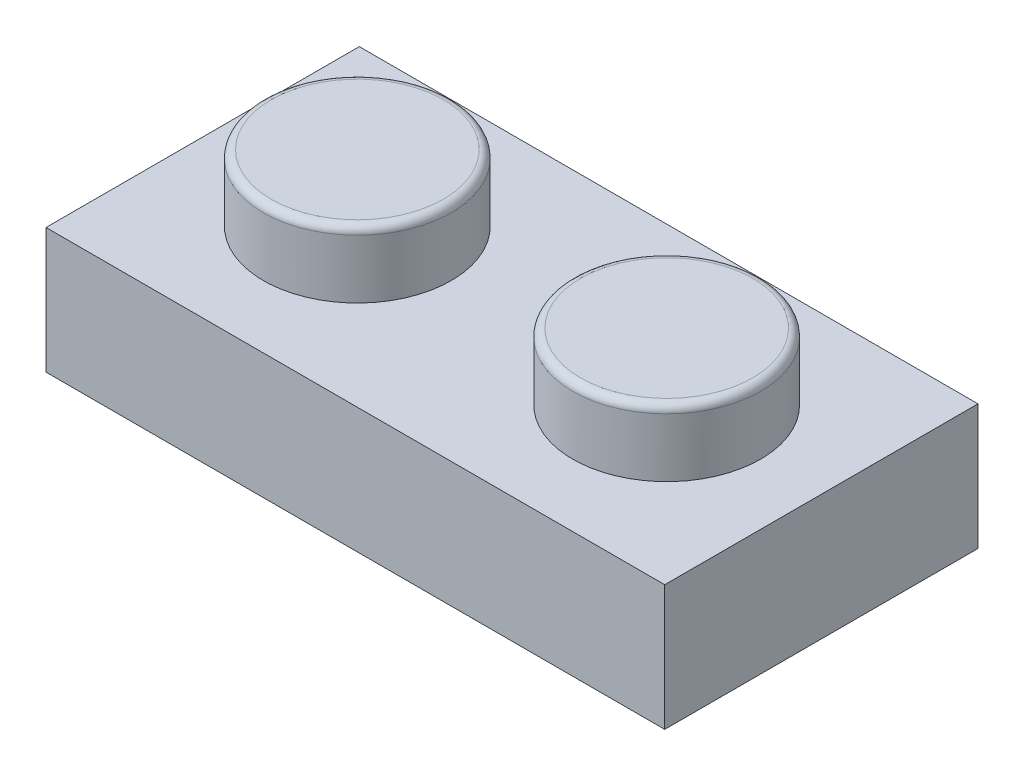
ISO-10303-21;
HEADER;
FILE_DESCRIPTION(('STEP AP214'),'2;1');
FILE_NAME('part.step','',(''),(''),'','','');
FILE_SCHEMA(('AUTOMOTIVE_DESIGN { 1 0 10303 214 1 1 1 1 }'));
ENDSEC;
DATA;
#1=APPLICATION_CONTEXT('core data for automotive mechanical design processes');
#2=APPLICATION_PROTOCOL_DEFINITION('international standard','automotive_design',2000,#1);
#3=PRODUCT_CONTEXT('',#1,'mechanical');
#4=PRODUCT('Part','Part','',(#3));
#5=PRODUCT_RELATED_PRODUCT_CATEGORY('part','',(#4));
#6=PRODUCT_DEFINITION_FORMATION('','',#4);
#7=PRODUCT_DEFINITION_CONTEXT('part definition',#1,'design');
#8=PRODUCT_DEFINITION('design','',#6,#7);
#9=PRODUCT_DEFINITION_SHAPE('','',#8);
#10=(LENGTH_UNIT() NAMED_UNIT(*) SI_UNIT(.MILLI.,.METRE.));
#11=(NAMED_UNIT(*) PLANE_ANGLE_UNIT() SI_UNIT($,.RADIAN.));
#12=(NAMED_UNIT(*) SI_UNIT($,.STERADIAN.) SOLID_ANGLE_UNIT());
#13=UNCERTAINTY_MEASURE_WITH_UNIT(LENGTH_MEASURE(1.E-05),#10,'distance_accuracy_value','');
#14=(GEOMETRIC_REPRESENTATION_CONTEXT(3) GLOBAL_UNCERTAINTY_ASSIGNED_CONTEXT((#13)) GLOBAL_UNIT_ASSIGNED_CONTEXT((#10,
#11,#12)) REPRESENTATION_CONTEXT('',''));
#15=CARTESIAN_POINT('',(0.,0.,0.));
#16=DIRECTION('',(0.,0.,1.));
#17=DIRECTION('',(1.,0.,0.));
#18=AXIS2_PLACEMENT_3D('',#15,#16,#17);
#19=CARTESIAN_POINT('',(0.,3.2,0.));
#20=DIRECTION('',(0.,-1.,0.));
#21=DIRECTION('',(0.,0.,-1.));
#22=AXIS2_PLACEMENT_3D('',#19,#20,#21);
#23=PLANE('',#22);
#24=CARTESIAN_POINT('',(3.95,3.2,-4.));
#25=DIRECTION('',(0.,-1.,0.));
#26=DIRECTION('',(0.,0.,-1.));
#27=AXIS2_PLACEMENT_3D('',#24,#25,#26);
#28=CIRCLE('',#27,2.4);
#29=CARTESIAN_POINT('',(3.95,3.2,-6.4));
#30=VERTEX_POINT('',#29);
#31=EDGE_CURVE('E111',#30,#30,#28,.F.);
#32=ORIENTED_EDGE('',*,*,#31,.F.);
#33=EDGE_LOOP('',(#32));
#34=FACE_BOUND('',#33,.T.);
#35=DIRECTION('',(1.,0.,0.));
#36=VECTOR('',#35,1.);
#37=CARTESIAN_POINT('',(15.8,3.2,0.));
#38=LINE('',#37,#36);
#39=CARTESIAN_POINT('',(0.,3.2,0.));
#40=VERTEX_POINT('',#39);
#41=CARTESIAN_POINT('',(15.8,3.2,0.));
#42=VERTEX_POINT('',#41);
#43=EDGE_CURVE('E86',#40,#42,#38,.T.);
#44=ORIENTED_EDGE('',*,*,#43,.T.);
#45=DIRECTION('',(0.,0.,-1.));
#46=VECTOR('',#45,1.);
#47=CARTESIAN_POINT('',(15.8,3.2,-8.));
#48=LINE('',#47,#46);
#49=CARTESIAN_POINT('',(15.8,3.2,-8.));
#50=VERTEX_POINT('',#49);
#51=EDGE_CURVE('E81',#42,#50,#48,.T.);
#52=ORIENTED_EDGE('',*,*,#51,.T.);
#53=DIRECTION('',(-1.,0.,0.));
#54=VECTOR('',#53,1.);
#55=CARTESIAN_POINT('',(0.,3.2,-8.));
#56=LINE('',#55,#54);
#57=CARTESIAN_POINT('',(0.,3.2,-8.));
#58=VERTEX_POINT('',#57);
#59=EDGE_CURVE('E84',#50,#58,#56,.T.);
#60=ORIENTED_EDGE('',*,*,#59,.T.);
#61=DIRECTION('',(0.,0.,1.));
#62=VECTOR('',#61,1.);
#63=CARTESIAN_POINT('',(0.,3.2,0.));
#64=LINE('',#63,#62);
#65=EDGE_CURVE('E50',#58,#40,#64,.T.);
#66=ORIENTED_EDGE('',*,*,#65,.T.);
#67=EDGE_LOOP('',(#44,#52,#60,#66));
#68=FACE_BOUND('',#67,.T.);
#69=CARTESIAN_POINT('',(11.85,3.2,-4.));
#70=DIRECTION('',(0.,-1.,0.));
#71=DIRECTION('',(0.,0.,-1.));
#72=AXIS2_PLACEMENT_3D('',#69,#70,#71);
#73=CIRCLE('',#72,2.4);
#74=CARTESIAN_POINT('',(11.85,3.2,-6.4));
#75=VERTEX_POINT('',#74);
#76=EDGE_CURVE('E114',#75,#75,#73,.F.);
#77=ORIENTED_EDGE('',*,*,#76,.F.);
#78=EDGE_LOOP('',(#77));
#79=FACE_BOUND('',#78,.T.);
#80=ADVANCED_FACE('F33',(#34,#68,#79),#23,.F.);
#81=CARTESIAN_POINT('',(15.8,3.2,0.));
#82=DIRECTION('',(0.,0.,-1.));
#83=DIRECTION('',(-1.,0.,0.));
#84=AXIS2_PLACEMENT_3D('',#81,#82,#83);
#85=PLANE('',#84);
#86=DIRECTION('',(1.,0.,0.));
#87=VECTOR('',#86,1.);
#88=CARTESIAN_POINT('',(15.8,0.,0.));
#89=LINE('',#88,#87);
#90=CARTESIAN_POINT('',(0.,0.,0.));
#91=VERTEX_POINT('',#90);
#92=CARTESIAN_POINT('',(15.8,0.,0.));
#93=VERTEX_POINT('',#92);
#94=EDGE_CURVE('E101',#91,#93,#89,.T.);
#95=ORIENTED_EDGE('',*,*,#94,.T.);
#96=DIRECTION('',(0.,-1.,0.));
#97=VECTOR('',#96,1.);
#98=CARTESIAN_POINT('',(15.8,3.2,0.));
#99=LINE('',#98,#97);
#100=EDGE_CURVE('E92',#42,#93,#99,.T.);
#101=ORIENTED_EDGE('',*,*,#100,.F.);
#102=ORIENTED_EDGE('',*,*,#43,.F.);
#103=DIRECTION('',(0.,-1.,0.));
#104=VECTOR('',#103,1.);
#105=CARTESIAN_POINT('',(0.,3.2,0.));
#106=LINE('',#105,#104);
#107=EDGE_CURVE('E97',#40,#91,#106,.T.);
#108=ORIENTED_EDGE('',*,*,#107,.T.);
#109=EDGE_LOOP('',(#95,#101,#102,#108));
#110=FACE_BOUND('',#109,.T.);
#111=ADVANCED_FACE('F149',(#110),#85,.F.);
#112=CARTESIAN_POINT('',(15.8,3.2,-8.));
#113=DIRECTION('',(-1.,0.,0.));
#114=DIRECTION('',(0.,0.,1.));
#115=AXIS2_PLACEMENT_3D('',#112,#113,#114);
#116=PLANE('',#115);
#117=DIRECTION('',(0.,0.,-1.));
#118=VECTOR('',#117,1.);
#119=CARTESIAN_POINT('',(15.8,0.,-8.));
#120=LINE('',#119,#118);
#121=CARTESIAN_POINT('',(15.8,0.,-8.));
#122=VERTEX_POINT('',#121);
#123=EDGE_CURVE('E91',#93,#122,#120,.T.);
#124=ORIENTED_EDGE('',*,*,#123,.T.);
#125=DIRECTION('',(0.,-1.,0.));
#126=VECTOR('',#125,1.);
#127=CARTESIAN_POINT('',(15.8,3.2,-8.));
#128=LINE('',#127,#126);
#129=EDGE_CURVE('E89',#50,#122,#128,.T.);
#130=ORIENTED_EDGE('',*,*,#129,.F.);
#131=ORIENTED_EDGE('',*,*,#51,.F.);
#132=ORIENTED_EDGE('',*,*,#100,.T.);
#133=EDGE_LOOP('',(#124,#130,#131,#132));
#134=FACE_BOUND('',#133,.T.);
#135=ADVANCED_FACE('F90',(#134),#116,.F.);
#136=CARTESIAN_POINT('',(0.,3.2,-8.));
#137=DIRECTION('',(0.,0.,1.));
#138=DIRECTION('',(1.,0.,0.));
#139=AXIS2_PLACEMENT_3D('',#136,#137,#138);
#140=PLANE('',#139);
#141=DIRECTION('',(-1.,0.,0.));
#142=VECTOR('',#141,1.);
#143=CARTESIAN_POINT('',(0.,0.,-8.));
#144=LINE('',#143,#142);
#145=CARTESIAN_POINT('',(0.,0.,-8.));
#146=VERTEX_POINT('',#145);
#147=EDGE_CURVE('E67',#122,#146,#144,.T.);
#148=ORIENTED_EDGE('',*,*,#147,.T.);
#149=DIRECTION('',(0.,-1.,0.));
#150=VECTOR('',#149,1.);
#151=CARTESIAN_POINT('',(0.,3.2,-8.));
#152=LINE('',#151,#150);
#153=EDGE_CURVE('E93',#58,#146,#152,.T.);
#154=ORIENTED_EDGE('',*,*,#153,.F.);
#155=ORIENTED_EDGE('',*,*,#59,.F.);
#156=ORIENTED_EDGE('',*,*,#129,.T.);
#157=EDGE_LOOP('',(#148,#154,#155,#156));
#158=FACE_BOUND('',#157,.T.);
#159=ADVANCED_FACE('F95',(#158),#140,.F.);
#160=CARTESIAN_POINT('',(0.,3.2,0.));
#161=DIRECTION('',(1.,0.,0.));
#162=DIRECTION('',(0.,0.,-1.));
#163=AXIS2_PLACEMENT_3D('',#160,#161,#162);
#164=PLANE('',#163);
#165=DIRECTION('',(0.,0.,1.));
#166=VECTOR('',#165,1.);
#167=CARTESIAN_POINT('',(0.,0.,0.));
#168=LINE('',#167,#166);
#169=EDGE_CURVE('E73',#146,#91,#168,.T.);
#170=ORIENTED_EDGE('',*,*,#169,.T.);
#171=ORIENTED_EDGE('',*,*,#107,.F.);
#172=ORIENTED_EDGE('',*,*,#65,.F.);
#173=ORIENTED_EDGE('',*,*,#153,.T.);
#174=EDGE_LOOP('',(#170,#171,#172,#173));
#175=FACE_BOUND('',#174,.T.);
#176=ADVANCED_FACE('F165',(#175),#164,.F.);
#177=CARTESIAN_POINT('',(0.,0.,0.));
#178=DIRECTION('',(0.,-1.,0.));
#179=DIRECTION('',(0.,0.,-1.));
#180=AXIS2_PLACEMENT_3D('',#177,#178,#179);
#181=PLANE('',#180);
#182=CARTESIAN_POINT('',(11.85,0.,-4.));
#183=DIRECTION('',(0.,-1.,0.));
#184=DIRECTION('',(0.,0.,-1.));
#185=AXIS2_PLACEMENT_3D('',#182,#183,#184);
#186=CIRCLE('',#185,1.9);
#187=CARTESIAN_POINT('',(11.85,0.,-5.9));
#188=VERTEX_POINT('',#187);
#189=EDGE_CURVE('E322',#188,#188,#186,.T.);
#190=ORIENTED_EDGE('',*,*,#189,.F.);
#191=EDGE_LOOP('',(#190));
#192=FACE_BOUND('',#191,.T.);
#193=CARTESIAN_POINT('',(3.95,0.,-4.));
#194=DIRECTION('',(0.,-1.,0.));
#195=DIRECTION('',(0.,0.,-1.));
#196=AXIS2_PLACEMENT_3D('',#193,#194,#195);
#197=CIRCLE('',#196,1.9);
#198=CARTESIAN_POINT('',(3.95,0.,-5.9));
#199=VERTEX_POINT('',#198);
#200=EDGE_CURVE('E104',#199,#199,#197,.T.);
#201=ORIENTED_EDGE('',*,*,#200,.F.);
#202=EDGE_LOOP('',(#201));
#203=FACE_BOUND('',#202,.T.);
#204=ORIENTED_EDGE('',*,*,#94,.F.);
#205=ORIENTED_EDGE('',*,*,#169,.F.);
#206=ORIENTED_EDGE('',*,*,#147,.F.);
#207=ORIENTED_EDGE('',*,*,#123,.F.);
#208=EDGE_LOOP('',(#204,#205,#206,#207));
#209=FACE_BOUND('',#208,.T.);
#210=ADVANCED_FACE('F162',(#192,#203,#209),#181,.T.);
#211=CARTESIAN_POINT('',(3.95,4.9,-4.));
#212=DIRECTION('',(0.,-1.,0.));
#213=DIRECTION('',(0.,0.,-1.));
#214=AXIS2_PLACEMENT_3D('',#211,#212,#213);
#215=CYLINDRICAL_SURFACE('',#214,2.4);
#216=CARTESIAN_POINT('',(3.95,4.7,-4.));
#217=DIRECTION('',(0.,1.,0.));
#218=DIRECTION('',(0.,0.,1.));
#219=AXIS2_PLACEMENT_3D('',#216,#217,#218);
#220=CIRCLE('',#219,2.4);
#221=CARTESIAN_POINT('',(3.95,4.7,-1.6));
#222=VERTEX_POINT('',#221);
#223=EDGE_CURVE('E120',#222,#222,#220,.F.);
#224=ORIENTED_EDGE('',*,*,#223,.T.);
#225=EDGE_LOOP('',(#224));
#226=FACE_BOUND('',#225,.T.);
#227=ORIENTED_EDGE('',*,*,#31,.T.);
#228=EDGE_LOOP('',(#227));
#229=FACE_BOUND('',#228,.T.);
#230=ADVANCED_FACE('F160',(#226,#229),#215,.T.);
#231=CARTESIAN_POINT('',(3.95,4.9,-4.));
#232=DIRECTION('',(0.,1.,0.));
#233=DIRECTION('',(0.,0.,1.));
#234=AXIS2_PLACEMENT_3D('',#231,#232,#233);
#235=PLANE('',#234);
#236=CARTESIAN_POINT('',(3.95,4.9,-4.));
#237=DIRECTION('',(0.,1.,0.));
#238=DIRECTION('',(0.,0.,1.));
#239=AXIS2_PLACEMENT_3D('',#236,#237,#238);
#240=CIRCLE('',#239,2.2);
#241=CARTESIAN_POINT('',(3.95,4.9,-1.8));
#242=VERTEX_POINT('',#241);
#243=EDGE_CURVE('E117',#242,#242,#240,.T.);
#244=ORIENTED_EDGE('',*,*,#243,.T.);
#245=EDGE_LOOP('',(#244));
#246=FACE_BOUND('',#245,.T.);
#247=ADVANCED_FACE('F197',(#246),#235,.T.);
#248=CARTESIAN_POINT('',(11.85,4.9,-4.));
#249=DIRECTION('',(0.,-1.,0.));
#250=DIRECTION('',(0.,0.,-1.));
#251=AXIS2_PLACEMENT_3D('',#248,#249,#250);
#252=CYLINDRICAL_SURFACE('',#251,2.4);
#253=CARTESIAN_POINT('',(11.85,4.7,-4.));
#254=DIRECTION('',(0.,1.,0.));
#255=DIRECTION('',(0.,0.,1.));
#256=AXIS2_PLACEMENT_3D('',#253,#254,#255);
#257=CIRCLE('',#256,2.4);
#258=CARTESIAN_POINT('',(11.85,4.7,-1.6));
#259=VERTEX_POINT('',#258);
#260=EDGE_CURVE('E126',#259,#259,#257,.F.);
#261=ORIENTED_EDGE('',*,*,#260,.T.);
#262=EDGE_LOOP('',(#261));
#263=FACE_BOUND('',#262,.T.);
#264=ORIENTED_EDGE('',*,*,#76,.T.);
#265=EDGE_LOOP('',(#264));
#266=FACE_BOUND('',#265,.T.);
#267=ADVANCED_FACE('F189',(#263,#266),#252,.T.);
#268=CARTESIAN_POINT('',(11.85,4.9,-4.));
#269=DIRECTION('',(0.,1.,0.));
#270=DIRECTION('',(0.,0.,1.));
#271=AXIS2_PLACEMENT_3D('',#268,#269,#270);
#272=PLANE('',#271);
#273=CARTESIAN_POINT('',(11.85,4.9,-4.));
#274=DIRECTION('',(0.,1.,0.));
#275=DIRECTION('',(0.,0.,1.));
#276=AXIS2_PLACEMENT_3D('',#273,#274,#275);
#277=CIRCLE('',#276,2.2);
#278=CARTESIAN_POINT('',(11.85,4.9,-1.8));
#279=VERTEX_POINT('',#278);
#280=EDGE_CURVE('E123',#279,#279,#277,.T.);
#281=ORIENTED_EDGE('',*,*,#280,.T.);
#282=EDGE_LOOP('',(#281));
#283=FACE_BOUND('',#282,.T.);
#284=ADVANCED_FACE('F186',(#283),#272,.T.);
#285=CARTESIAN_POINT('',(3.95,1.7,-4.));
#286=DIRECTION('',(0.,-1.,0.));
#287=DIRECTION('',(0.,0.,-1.));
#288=AXIS2_PLACEMENT_3D('',#285,#286,#287);
#289=CYLINDRICAL_SURFACE('',#288,1.9);
#290=CARTESIAN_POINT('',(3.95,1.5,-4.));
#291=DIRECTION('',(0.,-1.,0.));
#292=DIRECTION('',(0.,0.,-1.));
#293=AXIS2_PLACEMENT_3D('',#290,#291,#292);
#294=CIRCLE('',#293,1.9);
#295=CARTESIAN_POINT('',(3.95,1.5,-5.9));
#296=VERTEX_POINT('',#295);
#297=EDGE_CURVE('E11',#296,#296,#294,.F.);
#298=ORIENTED_EDGE('',*,*,#297,.T.);
#299=EDGE_LOOP('',(#298));
#300=FACE_BOUND('',#299,.T.);
#301=ORIENTED_EDGE('',*,*,#200,.T.);
#302=EDGE_LOOP('',(#301));
#303=FACE_BOUND('',#302,.T.);
#304=ADVANCED_FACE('F188',(#300,#303),#289,.F.);
#305=CARTESIAN_POINT('',(3.95,1.7,-4.));
#306=DIRECTION('',(0.,-1.,0.));
#307=DIRECTION('',(0.,0.,-1.));
#308=AXIS2_PLACEMENT_3D('',#305,#306,#307);
#309=PLANE('',#308);
#310=CARTESIAN_POINT('',(3.95,1.7,-4.));
#311=DIRECTION('',(0.,-1.,0.));
#312=DIRECTION('',(0.,0.,-1.));
#313=AXIS2_PLACEMENT_3D('',#310,#311,#312);
#314=CIRCLE('',#313,1.7);
#315=CARTESIAN_POINT('',(3.95,1.7,-5.7));
#316=VERTEX_POINT('',#315);
#317=EDGE_CURVE('E42',#316,#316,#314,.T.);
#318=ORIENTED_EDGE('',*,*,#317,.T.);
#319=EDGE_LOOP('',(#318));
#320=FACE_BOUND('',#319,.T.);
#321=ADVANCED_FACE('F137',(#320),#309,.T.);
#322=CARTESIAN_POINT('',(11.85,1.7,-4.));
#323=DIRECTION('',(0.,-1.,0.));
#324=DIRECTION('',(0.,0.,-1.));
#325=AXIS2_PLACEMENT_3D('',#322,#323,#324);
#326=CYLINDRICAL_SURFACE('',#325,1.9);
#327=CARTESIAN_POINT('',(11.85,1.5,-4.));
#328=DIRECTION('',(0.,-1.,0.));
#329=DIRECTION('',(0.,0.,-1.));
#330=AXIS2_PLACEMENT_3D('',#327,#328,#329);
#331=CIRCLE('',#330,1.9);
#332=CARTESIAN_POINT('',(11.85,1.5,-5.9));
#333=VERTEX_POINT('',#332);
#334=EDGE_CURVE('E132',#333,#333,#331,.F.);
#335=ORIENTED_EDGE('',*,*,#334,.T.);
#336=EDGE_LOOP('',(#335));
#337=FACE_BOUND('',#336,.T.);
#338=ORIENTED_EDGE('',*,*,#189,.T.);
#339=EDGE_LOOP('',(#338));
#340=FACE_BOUND('',#339,.T.);
#341=ADVANCED_FACE('F275',(#337,#340),#326,.F.);
#342=CARTESIAN_POINT('',(11.85,1.7,-4.));
#343=DIRECTION('',(0.,-1.,0.));
#344=DIRECTION('',(0.,0.,-1.));
#345=AXIS2_PLACEMENT_3D('',#342,#343,#344);
#346=PLANE('',#345);
#347=CARTESIAN_POINT('',(11.85,1.7,-4.));
#348=DIRECTION('',(0.,-1.,0.));
#349=DIRECTION('',(0.,0.,-1.));
#350=AXIS2_PLACEMENT_3D('',#347,#348,#349);
#351=CIRCLE('',#350,1.7);
#352=CARTESIAN_POINT('',(11.85,1.7,-5.7));
#353=VERTEX_POINT('',#352);
#354=EDGE_CURVE('E129',#353,#353,#351,.T.);
#355=ORIENTED_EDGE('',*,*,#354,.T.);
#356=EDGE_LOOP('',(#355));
#357=FACE_BOUND('',#356,.T.);
#358=ADVANCED_FACE('F176',(#357),#346,.T.);
#359=CARTESIAN_POINT('',(3.95,4.7,-4.));
#360=DIRECTION('',(0.,1.,0.));
#361=DIRECTION('',(0.,0.,1.));
#362=AXIS2_PLACEMENT_3D('',#359,#360,#361);
#363=TOROIDAL_SURFACE('',#362,2.2,0.2);
#364=ORIENTED_EDGE('',*,*,#223,.F.);
#365=EDGE_LOOP('',(#364));
#366=FACE_BOUND('',#365,.T.);
#367=ORIENTED_EDGE('',*,*,#243,.F.);
#368=EDGE_LOOP('',(#367));
#369=FACE_BOUND('',#368,.T.);
#370=ADVANCED_FACE('F173',(#366,#369),#363,.T.);
#371=CARTESIAN_POINT('',(11.85,4.7,-4.));
#372=DIRECTION('',(0.,1.,0.));
#373=DIRECTION('',(0.,0.,1.));
#374=AXIS2_PLACEMENT_3D('',#371,#372,#373);
#375=TOROIDAL_SURFACE('',#374,2.2,0.2);
#376=ORIENTED_EDGE('',*,*,#260,.F.);
#377=EDGE_LOOP('',(#376));
#378=FACE_BOUND('',#377,.T.);
#379=ORIENTED_EDGE('',*,*,#280,.F.);
#380=EDGE_LOOP('',(#379));
#381=FACE_BOUND('',#380,.T.);
#382=ADVANCED_FACE('F145',(#378,#381),#375,.T.);
#383=CARTESIAN_POINT('',(11.85,1.5,-4.));
#384=DIRECTION('',(0.,-1.,0.));
#385=DIRECTION('',(0.,0.,-1.));
#386=AXIS2_PLACEMENT_3D('',#383,#384,#385);
#387=TOROIDAL_SURFACE('',#386,1.7,0.2);
#388=ORIENTED_EDGE('',*,*,#334,.F.);
#389=EDGE_LOOP('',(#388));
#390=FACE_BOUND('',#389,.T.);
#391=ORIENTED_EDGE('',*,*,#354,.F.);
#392=EDGE_LOOP('',(#391));
#393=FACE_BOUND('',#392,.T.);
#394=ADVANCED_FACE('F140',(#390,#393),#387,.F.);
#395=CARTESIAN_POINT('',(3.95,1.5,-4.));
#396=DIRECTION('',(0.,-1.,0.));
#397=DIRECTION('',(0.,0.,-1.));
#398=AXIS2_PLACEMENT_3D('',#395,#396,#397);
#399=TOROIDAL_SURFACE('',#398,1.7,0.2);
#400=ORIENTED_EDGE('',*,*,#297,.F.);
#401=EDGE_LOOP('',(#400));
#402=FACE_BOUND('',#401,.T.);
#403=ORIENTED_EDGE('',*,*,#317,.F.);
#404=EDGE_LOOP('',(#403));
#405=FACE_BOUND('',#404,.T.);
#406=ADVANCED_FACE('F35',(#402,#405),#399,.F.);
#407=CLOSED_SHELL('',(#80,#111,#135,#159,#176,#210,#230,#247,#267,#284,#304,#321,#341,#358,#370,
#382,#394,#406));
#408=MANIFOLD_SOLID_BREP('B2',#407);
#409=ADVANCED_BREP_SHAPE_REPRESENTATION('',(#18,#408),#14);
#410=SHAPE_DEFINITION_REPRESENTATION(#9,#409);
ENDSEC;
END-ISO-10303-21;
